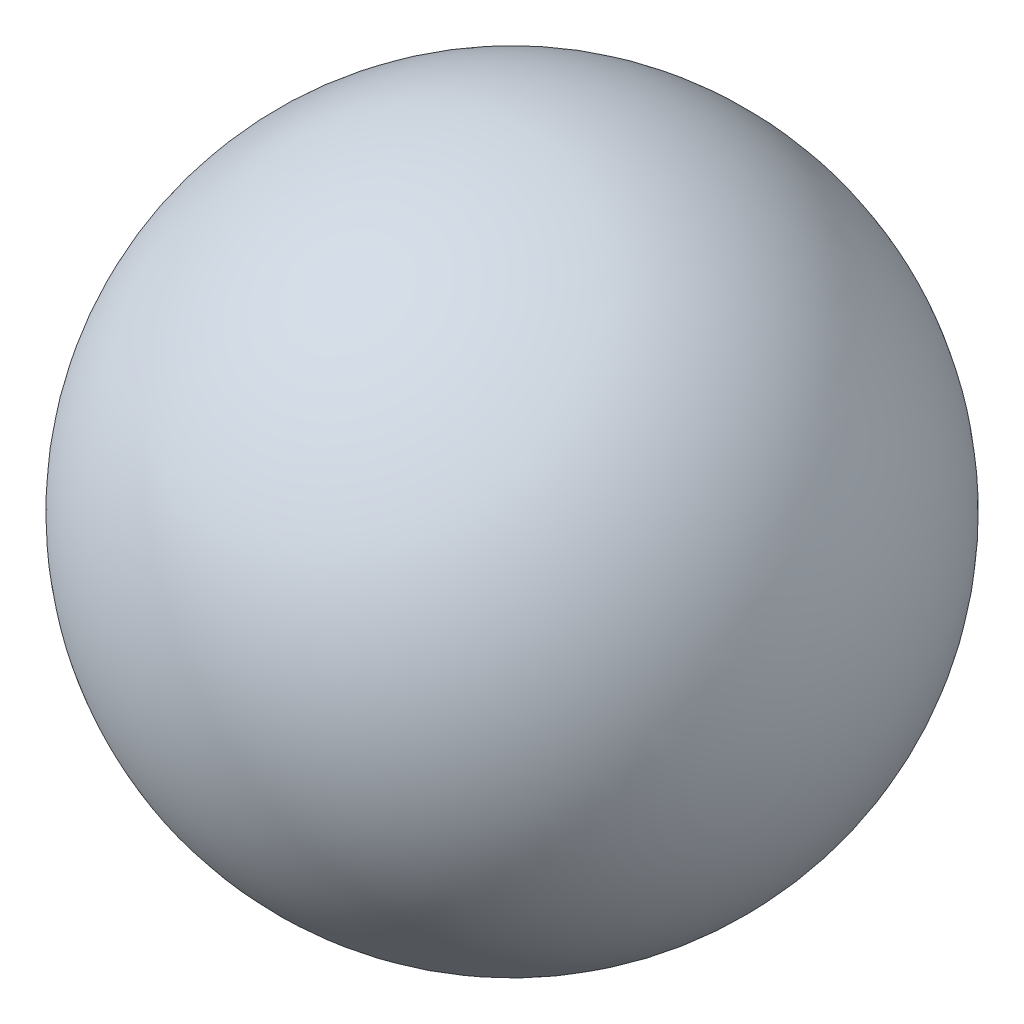
ISO-10303-21;
HEADER;
FILE_DESCRIPTION(('STEP AP214'),'2;1');
FILE_NAME('part.step','',(''),(''),'','','');
FILE_SCHEMA(('AUTOMOTIVE_DESIGN { 1 0 10303 214 1 1 1 1 }'));
ENDSEC;
DATA;
#1=APPLICATION_CONTEXT('core data for automotive mechanical design processes');
#2=APPLICATION_PROTOCOL_DEFINITION('international standard','automotive_design',2000,#1);
#3=PRODUCT_CONTEXT('',#1,'mechanical');
#4=PRODUCT('Part','Part','',(#3));
#5=PRODUCT_RELATED_PRODUCT_CATEGORY('part','',(#4));
#6=PRODUCT_DEFINITION_FORMATION('','',#4);
#7=PRODUCT_DEFINITION_CONTEXT('part definition',#1,'design');
#8=PRODUCT_DEFINITION('design','',#6,#7);
#9=PRODUCT_DEFINITION_SHAPE('','',#8);
#10=(LENGTH_UNIT() NAMED_UNIT(*) SI_UNIT(.MILLI.,.METRE.));
#11=(NAMED_UNIT(*) PLANE_ANGLE_UNIT() SI_UNIT($,.RADIAN.));
#12=(NAMED_UNIT(*) SI_UNIT($,.STERADIAN.) SOLID_ANGLE_UNIT());
#13=UNCERTAINTY_MEASURE_WITH_UNIT(LENGTH_MEASURE(1.E-05),#10,'distance_accuracy_value','');
#14=(GEOMETRIC_REPRESENTATION_CONTEXT(3) GLOBAL_UNCERTAINTY_ASSIGNED_CONTEXT((#13)) GLOBAL_UNIT_ASSIGNED_CONTEXT((#10,
#11,#12)) REPRESENTATION_CONTEXT('',''));
#15=CARTESIAN_POINT('',(0.,0.,0.));
#16=DIRECTION('',(0.,0.,1.));
#17=DIRECTION('',(1.,0.,0.));
#18=AXIS2_PLACEMENT_3D('',#15,#16,#17);
#19=CARTESIAN_POINT('',(0.,0.,-129.832));
#20=DIRECTION('',(0.,0.,1.));
#21=DIRECTION('',(1.,0.,0.));
#22=AXIS2_PLACEMENT_3D('',#19,#20,#21);
#23=PLANE('',#22);
#24=CARTESIAN_POINT('',(0.,0.,-129.832));
#25=DIRECTION('',(0.,0.,1.));
#26=DIRECTION('',(1.,0.,0.));
#27=AXIS2_PLACEMENT_3D('',#24,#25,#26);
#28=CIRCLE('',#27,76.1176837272391);
#29=CARTESIAN_POINT('',(76.1176837272391,0.,-129.832));
#30=VERTEX_POINT('',#29);
#31=EDGE_CURVE('E57',#30,#30,#28,.F.);
#32=ORIENTED_EDGE('',*,*,#31,.F.);
#33=EDGE_LOOP('',(#32));
#34=FACE_BOUND('',#33,.T.);
#35=CARTESIAN_POINT('',(0.,0.,-129.832));
#36=DIRECTION('',(0.,0.,1.));
#37=DIRECTION('',(1.,0.,0.));
#38=AXIS2_PLACEMENT_3D('',#35,#36,#37);
#39=CIRCLE('',#38,69.9992983964839);
#40=CARTESIAN_POINT('',(69.9992983964839,0.,-129.832));
#41=VERTEX_POINT('',#40);
#42=EDGE_CURVE('E11',#41,#41,#39,.T.);
#43=ORIENTED_EDGE('',*,*,#42,.F.);
#44=EDGE_LOOP('',(#43));
#45=FACE_BOUND('',#44,.T.);
#46=ADVANCED_FACE('F53',(#34,#45),#23,.T.);
#47=CARTESIAN_POINT('',(0.,0.,0.));
#48=DIRECTION('',(0.,-1.,0.));
#49=DIRECTION('',(1.,0.,0.));
#50=AXIS2_PLACEMENT_3D('',#47,#48,#49);
#51=SPHERICAL_SURFACE('',#50,147.5);
#52=CARTESIAN_POINT('',(0.,0.,0.));
#53=DIRECTION('',(0.,0.,1.));
#54=DIRECTION('',(1.,0.,0.));
#55=AXIS2_PLACEMENT_3D('',#52,#53,#54);
#56=SPHERICAL_SURFACE('',#55,147.5);
#57=ORIENTED_EDGE('',*,*,#42,.T.);
#58=EDGE_LOOP('',(#57));
#59=FACE_BOUND('',#58,.T.);
#60=ADVANCED_FACE('F69',(#59),#56,.F.);
#61=CARTESIAN_POINT('',(0.,0.,0.));
#62=DIRECTION('',(0.,-1.,0.));
#63=DIRECTION('',(-1.,0.,0.));
#64=AXIS2_PLACEMENT_3D('',#61,#62,#63);
#65=SPHERICAL_SURFACE('',#64,150.5);
#66=CARTESIAN_POINT('',(0.,0.,0.));
#67=DIRECTION('',(0.,0.,1.));
#68=DIRECTION('',(1.,0.,0.));
#69=AXIS2_PLACEMENT_3D('',#66,#67,#68);
#70=SPHERICAL_SURFACE('',#69,150.5);
#71=ORIENTED_EDGE('',*,*,#31,.T.);
#72=EDGE_LOOP('',(#71));
#73=FACE_BOUND('',#72,.T.);
#74=ADVANCED_FACE('F55',(#73),#70,.T.);
#75=CLOSED_SHELL('',(#46,#60,#74));
#76=MANIFOLD_SOLID_BREP('B2',#75);
#77=CARTESIAN_POINT('',(0.,0.,-129.832));
#78=DIRECTION('',(0.,0.,1.));
#79=DIRECTION('',(1.,0.,0.));
#80=AXIS2_PLACEMENT_3D('',#77,#78,#79);
#81=PLANE('',#80);
#82=CARTESIAN_POINT('',(0.,0.,-129.832));
#83=DIRECTION('',(0.,0.,1.));
#84=DIRECTION('',(1.,0.,0.));
#85=AXIS2_PLACEMENT_3D('',#82,#83,#84);
#86=CIRCLE('',#85,69.9992983964839);
#87=CARTESIAN_POINT('',(69.9992983964839,0.,-129.832));
#88=VERTEX_POINT('',#87);
#89=EDGE_CURVE('E52',#88,#88,#86,.T.);
#90=ORIENTED_EDGE('',*,*,#89,.T.);
#91=EDGE_LOOP('',(#90));
#92=FACE_BOUND('',#91,.T.);
#93=CARTESIAN_POINT('',(0.,0.,-129.832));
#94=DIRECTION('',(0.,0.,1.));
#95=DIRECTION('',(1.,0.,0.));
#96=AXIS2_PLACEMENT_3D('',#93,#94,#95);
#97=CIRCLE('',#96,76.1176837272391);
#98=CARTESIAN_POINT('',(76.1176837272391,0.,-129.832));
#99=VERTEX_POINT('',#98);
#100=EDGE_CURVE('E95',#99,#99,#97,.F.);
#101=ORIENTED_EDGE('',*,*,#100,.T.);
#102=EDGE_LOOP('',(#101));
#103=FACE_BOUND('',#102,.T.);
#104=ADVANCED_FACE('F92',(#92,#103),#81,.F.);
#105=CARTESIAN_POINT('',(0.,0.,0.));
#106=DIRECTION('',(0.,-1.,0.));
#107=DIRECTION('',(1.,0.,0.));
#108=AXIS2_PLACEMENT_3D('',#105,#106,#107);
#109=SPHERICAL_SURFACE('',#108,147.5);
#110=CARTESIAN_POINT('',(0.,0.,0.));
#111=DIRECTION('',(0.,0.,1.));
#112=DIRECTION('',(1.,0.,0.));
#113=AXIS2_PLACEMENT_3D('',#110,#111,#112);
#114=SPHERICAL_SURFACE('',#113,147.5);
#115=ORIENTED_EDGE('',*,*,#89,.F.);
#116=EDGE_LOOP('',(#115));
#117=FACE_BOUND('',#116,.T.);
#118=ADVANCED_FACE('F109',(#117),#114,.F.);
#119=CARTESIAN_POINT('',(0.,0.,0.));
#120=DIRECTION('',(0.,-1.,0.));
#121=DIRECTION('',(-1.,0.,0.));
#122=AXIS2_PLACEMENT_3D('',#119,#120,#121);
#123=SPHERICAL_SURFACE('',#122,150.5);
#124=CARTESIAN_POINT('',(0.,0.,0.));
#125=DIRECTION('',(0.,0.,1.));
#126=DIRECTION('',(1.,0.,0.));
#127=AXIS2_PLACEMENT_3D('',#124,#125,#126);
#128=SPHERICAL_SURFACE('',#127,150.5);
#129=ORIENTED_EDGE('',*,*,#100,.F.);
#130=EDGE_LOOP('',(#129));
#131=FACE_BOUND('',#130,.T.);
#132=ADVANCED_FACE('F107',(#131),#128,.T.);
#133=CLOSED_SHELL('',(#104,#118,#132));
#134=MANIFOLD_SOLID_BREP('B6',#133);
#135=ADVANCED_BREP_SHAPE_REPRESENTATION('',(#18,#76,#134),#14);
#136=SHAPE_DEFINITION_REPRESENTATION(#9,#135);
ENDSEC;
END-ISO-10303-21;
